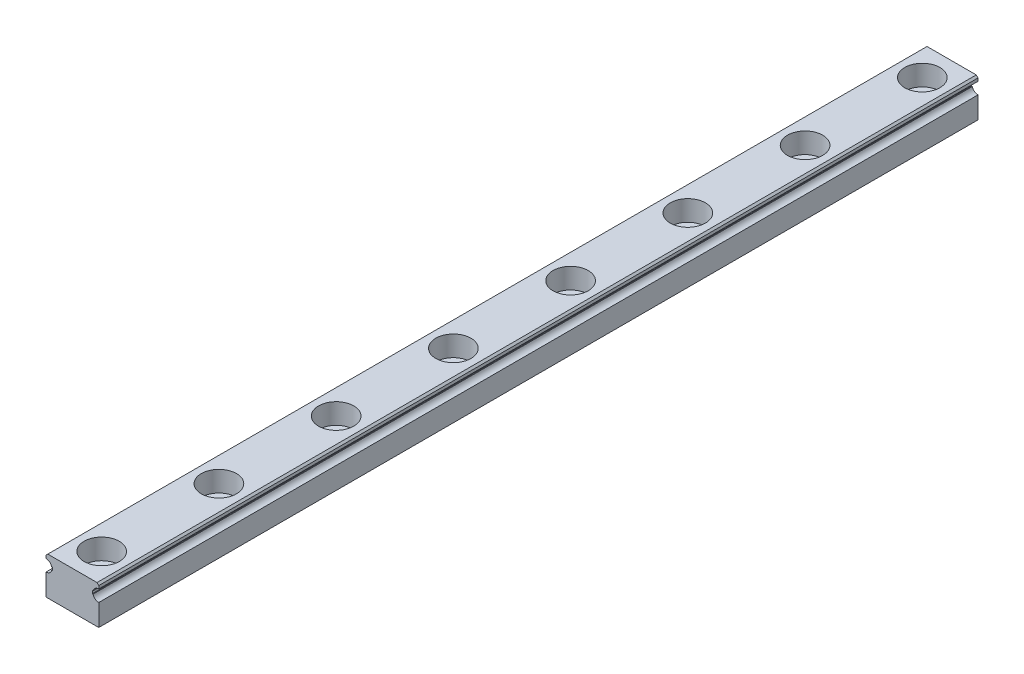
ISO-10303-21;
HEADER;
FILE_DESCRIPTION(('STEP AP214'),'2;1');
FILE_NAME('part.step','',(''),(''),'','','');
FILE_SCHEMA(('AUTOMOTIVE_DESIGN { 1 0 10303 214 1 1 1 1 }'));
ENDSEC;
DATA;
#1=APPLICATION_CONTEXT('core data for automotive mechanical design processes');
#2=APPLICATION_PROTOCOL_DEFINITION('international standard','automotive_design',2000,#1);
#3=PRODUCT_CONTEXT('',#1,'mechanical');
#4=PRODUCT('Part','Part','',(#3));
#5=PRODUCT_RELATED_PRODUCT_CATEGORY('part','',(#4));
#6=PRODUCT_DEFINITION_FORMATION('','',#4);
#7=PRODUCT_DEFINITION_CONTEXT('part definition',#1,'design');
#8=PRODUCT_DEFINITION('design','',#6,#7);
#9=PRODUCT_DEFINITION_SHAPE('','',#8);
#10=(LENGTH_UNIT() NAMED_UNIT(*) SI_UNIT(.MILLI.,.METRE.));
#11=(NAMED_UNIT(*) PLANE_ANGLE_UNIT() SI_UNIT($,.RADIAN.));
#12=(NAMED_UNIT(*) SI_UNIT($,.STERADIAN.) SOLID_ANGLE_UNIT());
#13=UNCERTAINTY_MEASURE_WITH_UNIT(LENGTH_MEASURE(1.E-05),#10,'distance_accuracy_value','');
#14=(GEOMETRIC_REPRESENTATION_CONTEXT(3) GLOBAL_UNCERTAINTY_ASSIGNED_CONTEXT((#13)) GLOBAL_UNIT_ASSIGNED_CONTEXT((#10,
#11,#12)) REPRESENTATION_CONTEXT('',''));
#15=CARTESIAN_POINT('',(0.,0.,0.));
#16=DIRECTION('',(0.,0.,1.));
#17=DIRECTION('',(1.,0.,0.));
#18=AXIS2_PLACEMENT_3D('',#15,#16,#17);
#19=CARTESIAN_POINT('',(0.,-3.25,145.));
#20=DIRECTION('',(0.,1.,0.));
#21=DIRECTION('',(0.,0.,1.));
#22=AXIS2_PLACEMENT_3D('',#19,#20,#21);
#23=CYLINDRICAL_SURFACE('',#22,1.75);
#24=CARTESIAN_POINT('',(0.,-0.25,145.));
#25=DIRECTION('',(0.,1.,0.));
#26=DIRECTION('',(0.,0.,1.));
#27=AXIS2_PLACEMENT_3D('',#24,#25,#26);
#28=CIRCLE('',#27,1.75);
#29=CARTESIAN_POINT('',(0.,-0.25,146.75));
#30=VERTEX_POINT('',#29);
#31=EDGE_CURVE('E11',#30,#30,#28,.T.);
#32=ORIENTED_EDGE('',*,*,#31,.T.);
#33=EDGE_LOOP('',(#32));
#34=FACE_BOUND('',#33,.T.);
#35=CARTESIAN_POINT('',(0.,-3.25,145.));
#36=DIRECTION('',(0.,1.,0.));
#37=DIRECTION('',(0.,0.,1.));
#38=AXIS2_PLACEMENT_3D('',#35,#36,#37);
#39=CIRCLE('',#38,1.75);
#40=CARTESIAN_POINT('',(0.,-3.25,146.75));
#41=VERTEX_POINT('',#40);
#42=EDGE_CURVE('E197',#41,#41,#39,.T.);
#43=ORIENTED_EDGE('',*,*,#42,.F.);
#44=EDGE_LOOP('',(#43));
#45=FACE_BOUND('',#44,.T.);
#46=ADVANCED_FACE('F17',(#34,#45),#23,.F.);
#47=CARTESIAN_POINT('',(0.,-3.25,125.));
#48=DIRECTION('',(0.,1.,0.));
#49=DIRECTION('',(0.,0.,1.));
#50=AXIS2_PLACEMENT_3D('',#47,#48,#49);
#51=CYLINDRICAL_SURFACE('',#50,1.75);
#52=CARTESIAN_POINT('',(0.,-0.25,125.));
#53=DIRECTION('',(0.,1.,0.));
#54=DIRECTION('',(0.,0.,1.));
#55=AXIS2_PLACEMENT_3D('',#52,#53,#54);
#56=CIRCLE('',#55,1.75);
#57=CARTESIAN_POINT('',(0.,-0.25,126.75));
#58=VERTEX_POINT('',#57);
#59=EDGE_CURVE('E289',#58,#58,#56,.T.);
#60=ORIENTED_EDGE('',*,*,#59,.T.);
#61=EDGE_LOOP('',(#60));
#62=FACE_BOUND('',#61,.T.);
#63=CARTESIAN_POINT('',(0.,-3.25,125.));
#64=DIRECTION('',(0.,1.,0.));
#65=DIRECTION('',(0.,0.,1.));
#66=AXIS2_PLACEMENT_3D('',#63,#64,#65);
#67=CIRCLE('',#66,1.75);
#68=CARTESIAN_POINT('',(0.,-3.25,126.75));
#69=VERTEX_POINT('',#68);
#70=EDGE_CURVE('E274',#69,#69,#67,.T.);
#71=ORIENTED_EDGE('',*,*,#70,.F.);
#72=EDGE_LOOP('',(#71));
#73=FACE_BOUND('',#72,.T.);
#74=ADVANCED_FACE('F862',(#62,#73),#51,.F.);
#75=CARTESIAN_POINT('',(0.,-3.25,105.));
#76=DIRECTION('',(0.,1.,0.));
#77=DIRECTION('',(0.,0.,1.));
#78=AXIS2_PLACEMENT_3D('',#75,#76,#77);
#79=CYLINDRICAL_SURFACE('',#78,1.75);
#80=CARTESIAN_POINT('',(0.,-0.25,105.));
#81=DIRECTION('',(0.,1.,0.));
#82=DIRECTION('',(0.,0.,1.));
#83=AXIS2_PLACEMENT_3D('',#80,#81,#82);
#84=CIRCLE('',#83,1.75);
#85=CARTESIAN_POINT('',(0.,-0.25,106.75));
#86=VERTEX_POINT('',#85);
#87=EDGE_CURVE('E290',#86,#86,#84,.T.);
#88=ORIENTED_EDGE('',*,*,#87,.T.);
#89=EDGE_LOOP('',(#88));
#90=FACE_BOUND('',#89,.T.);
#91=CARTESIAN_POINT('',(0.,-3.25,105.));
#92=DIRECTION('',(0.,1.,0.));
#93=DIRECTION('',(0.,0.,1.));
#94=AXIS2_PLACEMENT_3D('',#91,#92,#93);
#95=CIRCLE('',#94,1.75);
#96=CARTESIAN_POINT('',(0.,-3.25,106.75));
#97=VERTEX_POINT('',#96);
#98=EDGE_CURVE('E261',#97,#97,#95,.T.);
#99=ORIENTED_EDGE('',*,*,#98,.F.);
#100=EDGE_LOOP('',(#99));
#101=FACE_BOUND('',#100,.T.);
#102=ADVANCED_FACE('F856',(#90,#101),#79,.F.);
#103=CARTESIAN_POINT('',(0.,-3.25,85.));
#104=DIRECTION('',(0.,1.,0.));
#105=DIRECTION('',(0.,0.,1.));
#106=AXIS2_PLACEMENT_3D('',#103,#104,#105);
#107=CYLINDRICAL_SURFACE('',#106,1.75);
#108=CARTESIAN_POINT('',(0.,-0.25,85.));
#109=DIRECTION('',(0.,1.,0.));
#110=DIRECTION('',(0.,0.,1.));
#111=AXIS2_PLACEMENT_3D('',#108,#109,#110);
#112=CIRCLE('',#111,1.75);
#113=CARTESIAN_POINT('',(0.,-0.25,86.75));
#114=VERTEX_POINT('',#113);
#115=EDGE_CURVE('E345',#114,#114,#112,.T.);
#116=ORIENTED_EDGE('',*,*,#115,.T.);
#117=EDGE_LOOP('',(#116));
#118=FACE_BOUND('',#117,.T.);
#119=CARTESIAN_POINT('',(0.,-3.25,85.));
#120=DIRECTION('',(0.,1.,0.));
#121=DIRECTION('',(0.,0.,1.));
#122=AXIS2_PLACEMENT_3D('',#119,#120,#121);
#123=CIRCLE('',#122,1.75);
#124=CARTESIAN_POINT('',(0.,-3.25,86.75));
#125=VERTEX_POINT('',#124);
#126=EDGE_CURVE('E256',#125,#125,#123,.T.);
#127=ORIENTED_EDGE('',*,*,#126,.F.);
#128=EDGE_LOOP('',(#127));
#129=FACE_BOUND('',#128,.T.);
#130=ADVANCED_FACE('F861',(#118,#129),#107,.F.);
#131=CARTESIAN_POINT('',(0.,-3.25,65.));
#132=DIRECTION('',(0.,1.,0.));
#133=DIRECTION('',(0.,0.,1.));
#134=AXIS2_PLACEMENT_3D('',#131,#132,#133);
#135=CYLINDRICAL_SURFACE('',#134,1.75);
#136=CARTESIAN_POINT('',(0.,-0.25,65.));
#137=DIRECTION('',(0.,1.,0.));
#138=DIRECTION('',(0.,0.,1.));
#139=AXIS2_PLACEMENT_3D('',#136,#137,#138);
#140=CIRCLE('',#139,1.75);
#141=CARTESIAN_POINT('',(0.,-0.25,66.75));
#142=VERTEX_POINT('',#141);
#143=EDGE_CURVE('E346',#142,#142,#140,.T.);
#144=ORIENTED_EDGE('',*,*,#143,.T.);
#145=EDGE_LOOP('',(#144));
#146=FACE_BOUND('',#145,.T.);
#147=CARTESIAN_POINT('',(0.,-3.25,65.));
#148=DIRECTION('',(0.,1.,0.));
#149=DIRECTION('',(0.,0.,1.));
#150=AXIS2_PLACEMENT_3D('',#147,#148,#149);
#151=CIRCLE('',#150,1.75);
#152=CARTESIAN_POINT('',(0.,-3.25,66.75));
#153=VERTEX_POINT('',#152);
#154=EDGE_CURVE('E260',#153,#153,#151,.T.);
#155=ORIENTED_EDGE('',*,*,#154,.F.);
#156=EDGE_LOOP('',(#155));
#157=FACE_BOUND('',#156,.T.);
#158=ADVANCED_FACE('F1074',(#146,#157),#135,.F.);
#159=CARTESIAN_POINT('',(0.,-3.25,45.));
#160=DIRECTION('',(0.,1.,0.));
#161=DIRECTION('',(0.,0.,1.));
#162=AXIS2_PLACEMENT_3D('',#159,#160,#161);
#163=CYLINDRICAL_SURFACE('',#162,1.75);
#164=CARTESIAN_POINT('',(0.,-0.25,45.));
#165=DIRECTION('',(0.,1.,0.));
#166=DIRECTION('',(0.,0.,1.));
#167=AXIS2_PLACEMENT_3D('',#164,#165,#166);
#168=CIRCLE('',#167,1.75);
#169=CARTESIAN_POINT('',(0.,-0.25,46.75));
#170=VERTEX_POINT('',#169);
#171=EDGE_CURVE('E279',#170,#170,#168,.T.);
#172=ORIENTED_EDGE('',*,*,#171,.T.);
#173=EDGE_LOOP('',(#172));
#174=FACE_BOUND('',#173,.T.);
#175=CARTESIAN_POINT('',(0.,-3.25,45.));
#176=DIRECTION('',(0.,1.,0.));
#177=DIRECTION('',(0.,0.,1.));
#178=AXIS2_PLACEMENT_3D('',#175,#176,#177);
#179=CIRCLE('',#178,1.75);
#180=CARTESIAN_POINT('',(0.,-3.25,46.75));
#181=VERTEX_POINT('',#180);
#182=EDGE_CURVE('E284',#181,#181,#179,.T.);
#183=ORIENTED_EDGE('',*,*,#182,.F.);
#184=EDGE_LOOP('',(#183));
#185=FACE_BOUND('',#184,.T.);
#186=ADVANCED_FACE('F1065',(#174,#185),#163,.F.);
#187=CARTESIAN_POINT('',(0.,-3.25,25.));
#188=DIRECTION('',(0.,1.,0.));
#189=DIRECTION('',(0.,0.,1.));
#190=AXIS2_PLACEMENT_3D('',#187,#188,#189);
#191=CYLINDRICAL_SURFACE('',#190,1.75);
#192=CARTESIAN_POINT('',(0.,-0.25,25.));
#193=DIRECTION('',(0.,1.,0.));
#194=DIRECTION('',(0.,0.,1.));
#195=AXIS2_PLACEMENT_3D('',#192,#193,#194);
#196=CIRCLE('',#195,1.75);
#197=CARTESIAN_POINT('',(0.,-0.25,26.75));
#198=VERTEX_POINT('',#197);
#199=EDGE_CURVE('E280',#198,#198,#196,.T.);
#200=ORIENTED_EDGE('',*,*,#199,.T.);
#201=EDGE_LOOP('',(#200));
#202=FACE_BOUND('',#201,.T.);
#203=CARTESIAN_POINT('',(0.,-3.25,25.));
#204=DIRECTION('',(0.,1.,0.));
#205=DIRECTION('',(0.,0.,1.));
#206=AXIS2_PLACEMENT_3D('',#203,#204,#205);
#207=CIRCLE('',#206,1.75);
#208=CARTESIAN_POINT('',(0.,-3.25,26.75));
#209=VERTEX_POINT('',#208);
#210=EDGE_CURVE('E294',#209,#209,#207,.T.);
#211=ORIENTED_EDGE('',*,*,#210,.F.);
#212=EDGE_LOOP('',(#211));
#213=FACE_BOUND('',#212,.T.);
#214=ADVANCED_FACE('F843',(#202,#213),#191,.F.);
#215=CARTESIAN_POINT('',(0.,-0.25,145.));
#216=DIRECTION('',(0.,1.,0.));
#217=DIRECTION('',(0.,0.,1.));
#218=AXIS2_PLACEMENT_3D('',#215,#216,#217);
#219=CYLINDRICAL_SURFACE('',#218,3.);
#220=CARTESIAN_POINT('',(0.,3.25,145.));
#221=DIRECTION('',(0.,1.,0.));
#222=DIRECTION('',(0.,0.,1.));
#223=AXIS2_PLACEMENT_3D('',#220,#221,#222);
#224=CIRCLE('',#223,3.);
#225=CARTESIAN_POINT('',(0.,3.25,148.));
#226=VERTEX_POINT('',#225);
#227=EDGE_CURVE('E228',#226,#226,#224,.T.);
#228=ORIENTED_EDGE('',*,*,#227,.T.);
#229=EDGE_LOOP('',(#228));
#230=FACE_BOUND('',#229,.T.);
#231=CARTESIAN_POINT('',(0.,-0.25,145.));
#232=DIRECTION('',(0.,1.,0.));
#233=DIRECTION('',(0.,0.,1.));
#234=AXIS2_PLACEMENT_3D('',#231,#232,#233);
#235=CIRCLE('',#234,3.);
#236=CARTESIAN_POINT('',(0.,-0.25,148.));
#237=VERTEX_POINT('',#236);
#238=EDGE_CURVE('E26',#237,#237,#235,.T.);
#239=ORIENTED_EDGE('',*,*,#238,.F.);
#240=EDGE_LOOP('',(#239));
#241=FACE_BOUND('',#240,.T.);
#242=ADVANCED_FACE('F822',(#230,#241),#219,.F.);
#243=CARTESIAN_POINT('',(0.,-0.25,145.));
#244=DIRECTION('',(0.,1.,0.));
#245=DIRECTION('',(1.,0.,0.));
#246=AXIS2_PLACEMENT_3D('',#243,#244,#245);
#247=PLANE('',#246);
#248=ORIENTED_EDGE('',*,*,#31,.F.);
#249=EDGE_LOOP('',(#248));
#250=FACE_BOUND('',#249,.T.);
#251=ORIENTED_EDGE('',*,*,#238,.T.);
#252=EDGE_LOOP('',(#251));
#253=FACE_BOUND('',#252,.T.);
#254=ADVANCED_FACE('F816',(#250,#253),#247,.T.);
#255=CARTESIAN_POINT('',(0.,-0.25,125.));
#256=DIRECTION('',(0.,1.,0.));
#257=DIRECTION('',(0.,0.,1.));
#258=AXIS2_PLACEMENT_3D('',#255,#256,#257);
#259=CYLINDRICAL_SURFACE('',#258,3.);
#260=CARTESIAN_POINT('',(0.,3.25,125.));
#261=DIRECTION('',(0.,1.,0.));
#262=DIRECTION('',(0.,0.,1.));
#263=AXIS2_PLACEMENT_3D('',#260,#261,#262);
#264=CIRCLE('',#263,3.);
#265=CARTESIAN_POINT('',(0.,3.25,128.));
#266=VERTEX_POINT('',#265);
#267=EDGE_CURVE('E232',#266,#266,#264,.T.);
#268=ORIENTED_EDGE('',*,*,#267,.T.);
#269=EDGE_LOOP('',(#268));
#270=FACE_BOUND('',#269,.T.);
#271=CARTESIAN_POINT('',(0.,-0.25,125.));
#272=DIRECTION('',(0.,1.,0.));
#273=DIRECTION('',(0.,0.,1.));
#274=AXIS2_PLACEMENT_3D('',#271,#272,#273);
#275=CIRCLE('',#274,3.);
#276=CARTESIAN_POINT('',(0.,-0.25,128.));
#277=VERTEX_POINT('',#276);
#278=EDGE_CURVE('E285',#277,#277,#275,.T.);
#279=ORIENTED_EDGE('',*,*,#278,.F.);
#280=EDGE_LOOP('',(#279));
#281=FACE_BOUND('',#280,.T.);
#282=ADVANCED_FACE('F821',(#270,#281),#259,.F.);
#283=CARTESIAN_POINT('',(0.,-0.25,125.));
#284=DIRECTION('',(0.,1.,0.));
#285=DIRECTION('',(1.,0.,0.));
#286=AXIS2_PLACEMENT_3D('',#283,#284,#285);
#287=PLANE('',#286);
#288=ORIENTED_EDGE('',*,*,#59,.F.);
#289=EDGE_LOOP('',(#288));
#290=FACE_BOUND('',#289,.T.);
#291=ORIENTED_EDGE('',*,*,#278,.T.);
#292=EDGE_LOOP('',(#291));
#293=FACE_BOUND('',#292,.T.);
#294=ADVANCED_FACE('F1042',(#290,#293),#287,.T.);
#295=CARTESIAN_POINT('',(0.,-0.25,105.));
#296=DIRECTION('',(0.,1.,0.));
#297=DIRECTION('',(0.,0.,1.));
#298=AXIS2_PLACEMENT_3D('',#295,#296,#297);
#299=CYLINDRICAL_SURFACE('',#298,3.);
#300=CARTESIAN_POINT('',(0.,3.25,105.));
#301=DIRECTION('',(0.,1.,0.));
#302=DIRECTION('',(0.,0.,1.));
#303=AXIS2_PLACEMENT_3D('',#300,#301,#302);
#304=CIRCLE('',#303,3.);
#305=CARTESIAN_POINT('',(0.,3.25,108.));
#306=VERTEX_POINT('',#305);
#307=EDGE_CURVE('E236',#306,#306,#304,.T.);
#308=ORIENTED_EDGE('',*,*,#307,.T.);
#309=EDGE_LOOP('',(#308));
#310=FACE_BOUND('',#309,.T.);
#311=CARTESIAN_POINT('',(0.,-0.25,105.));
#312=DIRECTION('',(0.,1.,0.));
#313=DIRECTION('',(0.,0.,1.));
#314=AXIS2_PLACEMENT_3D('',#311,#312,#313);
#315=CIRCLE('',#314,3.);
#316=CARTESIAN_POINT('',(0.,-0.25,108.));
#317=VERTEX_POINT('',#316);
#318=EDGE_CURVE('E351',#317,#317,#315,.T.);
#319=ORIENTED_EDGE('',*,*,#318,.F.);
#320=EDGE_LOOP('',(#319));
#321=FACE_BOUND('',#320,.T.);
#322=ADVANCED_FACE('F895',(#310,#321),#299,.F.);
#323=CARTESIAN_POINT('',(0.,-0.25,105.));
#324=DIRECTION('',(0.,1.,0.));
#325=DIRECTION('',(1.,0.,0.));
#326=AXIS2_PLACEMENT_3D('',#323,#324,#325);
#327=PLANE('',#326);
#328=ORIENTED_EDGE('',*,*,#87,.F.);
#329=EDGE_LOOP('',(#328));
#330=FACE_BOUND('',#329,.T.);
#331=ORIENTED_EDGE('',*,*,#318,.T.);
#332=EDGE_LOOP('',(#331));
#333=FACE_BOUND('',#332,.T.);
#334=ADVANCED_FACE('F889',(#330,#333),#327,.T.);
#335=CARTESIAN_POINT('',(0.,-0.25,85.));
#336=DIRECTION('',(0.,1.,0.));
#337=DIRECTION('',(0.,0.,1.));
#338=AXIS2_PLACEMENT_3D('',#335,#336,#337);
#339=CYLINDRICAL_SURFACE('',#338,3.);
#340=CARTESIAN_POINT('',(0.,3.25,85.));
#341=DIRECTION('',(0.,1.,0.));
#342=DIRECTION('',(0.,0.,1.));
#343=AXIS2_PLACEMENT_3D('',#340,#341,#342);
#344=CIRCLE('',#343,3.);
#345=CARTESIAN_POINT('',(0.,3.25,88.));
#346=VERTEX_POINT('',#345);
#347=EDGE_CURVE('E240',#346,#346,#344,.T.);
#348=ORIENTED_EDGE('',*,*,#347,.T.);
#349=EDGE_LOOP('',(#348));
#350=FACE_BOUND('',#349,.T.);
#351=CARTESIAN_POINT('',(0.,-0.25,85.));
#352=DIRECTION('',(0.,1.,0.));
#353=DIRECTION('',(0.,0.,1.));
#354=AXIS2_PLACEMENT_3D('',#351,#352,#353);
#355=CIRCLE('',#354,3.);
#356=CARTESIAN_POINT('',(0.,-0.25,88.));
#357=VERTEX_POINT('',#356);
#358=EDGE_CURVE('E341',#357,#357,#355,.T.);
#359=ORIENTED_EDGE('',*,*,#358,.F.);
#360=EDGE_LOOP('',(#359));
#361=FACE_BOUND('',#360,.T.);
#362=ADVANCED_FACE('F894',(#350,#361),#339,.F.);
#363=CARTESIAN_POINT('',(0.,-0.25,85.));
#364=DIRECTION('',(0.,1.,0.));
#365=DIRECTION('',(1.,0.,0.));
#366=AXIS2_PLACEMENT_3D('',#363,#364,#365);
#367=PLANE('',#366);
#368=ORIENTED_EDGE('',*,*,#115,.F.);
#369=EDGE_LOOP('',(#368));
#370=FACE_BOUND('',#369,.T.);
#371=ORIENTED_EDGE('',*,*,#358,.T.);
#372=EDGE_LOOP('',(#371));
#373=FACE_BOUND('',#372,.T.);
#374=ADVANCED_FACE('F1019',(#370,#373),#367,.T.);
#375=CARTESIAN_POINT('',(0.,-0.25,65.));
#376=DIRECTION('',(0.,1.,0.));
#377=DIRECTION('',(0.,0.,1.));
#378=AXIS2_PLACEMENT_3D('',#375,#376,#377);
#379=CYLINDRICAL_SURFACE('',#378,3.);
#380=CARTESIAN_POINT('',(0.,3.25,65.));
#381=DIRECTION('',(0.,1.,0.));
#382=DIRECTION('',(0.,0.,1.));
#383=AXIS2_PLACEMENT_3D('',#380,#381,#382);
#384=CIRCLE('',#383,3.);
#385=CARTESIAN_POINT('',(0.,3.25,68.));
#386=VERTEX_POINT('',#385);
#387=EDGE_CURVE('E244',#386,#386,#384,.T.);
#388=ORIENTED_EDGE('',*,*,#387,.T.);
#389=EDGE_LOOP('',(#388));
#390=FACE_BOUND('',#389,.T.);
#391=CARTESIAN_POINT('',(0.,-0.25,65.));
#392=DIRECTION('',(0.,1.,0.));
#393=DIRECTION('',(0.,0.,1.));
#394=AXIS2_PLACEMENT_3D('',#391,#392,#393);
#395=CIRCLE('',#394,3.);
#396=CARTESIAN_POINT('',(0.,-0.25,68.));
#397=VERTEX_POINT('',#396);
#398=EDGE_CURVE('E389',#397,#397,#395,.T.);
#399=ORIENTED_EDGE('',*,*,#398,.F.);
#400=EDGE_LOOP('',(#399));
#401=FACE_BOUND('',#400,.T.);
#402=ADVANCED_FACE('F1010',(#390,#401),#379,.F.);
#403=CARTESIAN_POINT('',(0.,-0.25,65.));
#404=DIRECTION('',(0.,1.,0.));
#405=DIRECTION('',(1.,0.,0.));
#406=AXIS2_PLACEMENT_3D('',#403,#404,#405);
#407=PLANE('',#406);
#408=ORIENTED_EDGE('',*,*,#143,.F.);
#409=EDGE_LOOP('',(#408));
#410=FACE_BOUND('',#409,.T.);
#411=ORIENTED_EDGE('',*,*,#398,.T.);
#412=EDGE_LOOP('',(#411));
#413=FACE_BOUND('',#412,.T.);
#414=ADVANCED_FACE('F1001',(#410,#413),#407,.T.);
#415=CARTESIAN_POINT('',(0.,-0.25,45.));
#416=DIRECTION('',(0.,1.,0.));
#417=DIRECTION('',(0.,0.,1.));
#418=AXIS2_PLACEMENT_3D('',#415,#416,#417);
#419=CYLINDRICAL_SURFACE('',#418,3.);
#420=CARTESIAN_POINT('',(0.,3.25,45.));
#421=DIRECTION('',(0.,1.,0.));
#422=DIRECTION('',(0.,0.,1.));
#423=AXIS2_PLACEMENT_3D('',#420,#421,#422);
#424=CIRCLE('',#423,3.);
#425=CARTESIAN_POINT('',(0.,3.25,48.));
#426=VERTEX_POINT('',#425);
#427=EDGE_CURVE('E248',#426,#426,#424,.T.);
#428=ORIENTED_EDGE('',*,*,#427,.T.);
#429=EDGE_LOOP('',(#428));
#430=FACE_BOUND('',#429,.T.);
#431=CARTESIAN_POINT('',(0.,-0.25,45.));
#432=DIRECTION('',(0.,1.,0.));
#433=DIRECTION('',(0.,0.,1.));
#434=AXIS2_PLACEMENT_3D('',#431,#432,#433);
#435=CIRCLE('',#434,3.);
#436=CARTESIAN_POINT('',(0.,-0.25,48.));
#437=VERTEX_POINT('',#436);
#438=EDGE_CURVE('E275',#437,#437,#435,.T.);
#439=ORIENTED_EDGE('',*,*,#438,.F.);
#440=EDGE_LOOP('',(#439));
#441=FACE_BOUND('',#440,.T.);
#442=ADVANCED_FACE('F992',(#430,#441),#419,.F.);
#443=CARTESIAN_POINT('',(0.,-0.25,45.));
#444=DIRECTION('',(0.,1.,0.));
#445=DIRECTION('',(1.,0.,0.));
#446=AXIS2_PLACEMENT_3D('',#443,#444,#445);
#447=PLANE('',#446);
#448=ORIENTED_EDGE('',*,*,#171,.F.);
#449=EDGE_LOOP('',(#448));
#450=FACE_BOUND('',#449,.T.);
#451=ORIENTED_EDGE('',*,*,#438,.T.);
#452=EDGE_LOOP('',(#451));
#453=FACE_BOUND('',#452,.T.);
#454=ADVANCED_FACE('F776',(#450,#453),#447,.T.);
#455=CARTESIAN_POINT('',(0.,-0.25,25.));
#456=DIRECTION('',(0.,1.,0.));
#457=DIRECTION('',(1.,0.,0.));
#458=AXIS2_PLACEMENT_3D('',#455,#456,#457);
#459=PLANE('',#458);
#460=ORIENTED_EDGE('',*,*,#199,.F.);
#461=EDGE_LOOP('',(#460));
#462=FACE_BOUND('',#461,.T.);
#463=CARTESIAN_POINT('',(0.,-0.25,25.));
#464=DIRECTION('',(0.,1.,0.));
#465=DIRECTION('',(0.,0.,1.));
#466=AXIS2_PLACEMENT_3D('',#463,#464,#465);
#467=CIRCLE('',#466,3.);
#468=CARTESIAN_POINT('',(0.,-0.25,28.));
#469=VERTEX_POINT('',#468);
#470=EDGE_CURVE('E306',#469,#469,#467,.T.);
#471=ORIENTED_EDGE('',*,*,#470,.T.);
#472=EDGE_LOOP('',(#471));
#473=FACE_BOUND('',#472,.T.);
#474=ADVANCED_FACE('F770',(#462,#473),#459,.T.);
#475=CARTESIAN_POINT('',(0.,-0.25,25.));
#476=DIRECTION('',(0.,1.,0.));
#477=DIRECTION('',(0.,0.,1.));
#478=AXIS2_PLACEMENT_3D('',#475,#476,#477);
#479=CYLINDRICAL_SURFACE('',#478,3.);
#480=CARTESIAN_POINT('',(0.,3.25,25.));
#481=DIRECTION('',(0.,1.,0.));
#482=DIRECTION('',(0.,0.,1.));
#483=AXIS2_PLACEMENT_3D('',#480,#481,#482);
#484=CIRCLE('',#483,3.);
#485=CARTESIAN_POINT('',(0.,3.25,28.));
#486=VERTEX_POINT('',#485);
#487=EDGE_CURVE('E224',#486,#486,#484,.T.);
#488=ORIENTED_EDGE('',*,*,#487,.T.);
#489=EDGE_LOOP('',(#488));
#490=FACE_BOUND('',#489,.T.);
#491=ORIENTED_EDGE('',*,*,#470,.F.);
#492=EDGE_LOOP('',(#491));
#493=FACE_BOUND('',#492,.T.);
#494=ADVANCED_FACE('F775',(#490,#493),#479,.F.);
#495=CARTESIAN_POINT('',(0.,-3.25,5.));
#496=DIRECTION('',(0.,1.,0.));
#497=DIRECTION('',(0.,0.,1.));
#498=AXIS2_PLACEMENT_3D('',#495,#496,#497);
#499=CYLINDRICAL_SURFACE('',#498,1.75);
#500=CARTESIAN_POINT('',(0.,-0.25,5.));
#501=DIRECTION('',(0.,1.,0.));
#502=DIRECTION('',(0.,0.,1.));
#503=AXIS2_PLACEMENT_3D('',#500,#501,#502);
#504=CIRCLE('',#503,1.75);
#505=CARTESIAN_POINT('',(0.,-0.25,6.75));
#506=VERTEX_POINT('',#505);
#507=EDGE_CURVE('E340',#506,#506,#504,.T.);
#508=ORIENTED_EDGE('',*,*,#507,.T.);
#509=EDGE_LOOP('',(#508));
#510=FACE_BOUND('',#509,.T.);
#511=CARTESIAN_POINT('',(0.,-3.25,5.));
#512=DIRECTION('',(0.,1.,0.));
#513=DIRECTION('',(0.,0.,1.));
#514=AXIS2_PLACEMENT_3D('',#511,#512,#513);
#515=CIRCLE('',#514,1.75);
#516=CARTESIAN_POINT('',(0.,-3.25,6.75));
#517=VERTEX_POINT('',#516);
#518=EDGE_CURVE('E186',#517,#517,#515,.T.);
#519=ORIENTED_EDGE('',*,*,#518,.F.);
#520=EDGE_LOOP('',(#519));
#521=FACE_BOUND('',#520,.T.);
#522=ADVANCED_FACE('F969',(#510,#521),#499,.F.);
#523=CARTESIAN_POINT('',(0.,-0.25,5.));
#524=DIRECTION('',(0.,1.,0.));
#525=DIRECTION('',(1.,0.,0.));
#526=AXIS2_PLACEMENT_3D('',#523,#524,#525);
#527=PLANE('',#526);
#528=ORIENTED_EDGE('',*,*,#507,.F.);
#529=EDGE_LOOP('',(#528));
#530=FACE_BOUND('',#529,.T.);
#531=CARTESIAN_POINT('',(0.,-0.25,5.));
#532=DIRECTION('',(0.,1.,0.));
#533=DIRECTION('',(0.,0.,1.));
#534=AXIS2_PLACEMENT_3D('',#531,#532,#533);
#535=CIRCLE('',#534,3.);
#536=CARTESIAN_POINT('',(0.,-0.25,8.));
#537=VERTEX_POINT('',#536);
#538=EDGE_CURVE('E336',#537,#537,#535,.T.);
#539=ORIENTED_EDGE('',*,*,#538,.T.);
#540=EDGE_LOOP('',(#539));
#541=FACE_BOUND('',#540,.T.);
#542=ADVANCED_FACE('F960',(#530,#541),#527,.T.);
#543=CARTESIAN_POINT('',(0.,-0.25,5.));
#544=DIRECTION('',(0.,1.,0.));
#545=DIRECTION('',(0.,0.,1.));
#546=AXIS2_PLACEMENT_3D('',#543,#544,#545);
#547=CYLINDRICAL_SURFACE('',#546,3.);
#548=CARTESIAN_POINT('',(0.,3.25,5.));
#549=DIRECTION('',(0.,1.,0.));
#550=DIRECTION('',(0.,0.,1.));
#551=AXIS2_PLACEMENT_3D('',#548,#549,#550);
#552=CIRCLE('',#551,3.);
#553=CARTESIAN_POINT('',(0.,3.25,8.));
#554=VERTEX_POINT('',#553);
#555=EDGE_CURVE('E220',#554,#554,#552,.T.);
#556=ORIENTED_EDGE('',*,*,#555,.T.);
#557=EDGE_LOOP('',(#556));
#558=FACE_BOUND('',#557,.T.);
#559=ORIENTED_EDGE('',*,*,#538,.F.);
#560=EDGE_LOOP('',(#559));
#561=FACE_BOUND('',#560,.T.);
#562=ADVANCED_FACE('F952',(#558,#561),#547,.F.);
#563=CARTESIAN_POINT('',(-4.5,1.45,0.));
#564=DIRECTION('',(0.,0.,1.));
#565=DIRECTION('',(1.,0.,0.));
#566=AXIS2_PLACEMENT_3D('',#563,#564,#565);
#567=PLANE('',#566);
#568=DIRECTION('',(-1.,0.,0.));
#569=VECTOR('',#568,1.);
#570=CARTESIAN_POINT('',(4.20000000000009,3.25,0.));
#571=LINE('',#570,#569);
#572=CARTESIAN_POINT('',(4.20000000000009,3.25,0.));
#573=VERTEX_POINT('',#572);
#574=CARTESIAN_POINT('',(-4.2,3.25,0.));
#575=VERTEX_POINT('',#574);
#576=EDGE_CURVE('E212',#573,#575,#571,.T.);
#577=ORIENTED_EDGE('',*,*,#576,.F.);
#578=DIRECTION('',(0.707106781186483,-0.707106781186612,0.));
#579=VECTOR('',#578,1.);
#580=CARTESIAN_POINT('',(4.5,2.95,0.));
#581=LINE('',#580,#579);
#582=CARTESIAN_POINT('',(4.5,2.95,0.));
#583=VERTEX_POINT('',#582);
#584=EDGE_CURVE('E255',#573,#583,#581,.T.);
#585=ORIENTED_EDGE('',*,*,#584,.T.);
#586=DIRECTION('',(0.,1.,0.));
#587=VECTOR('',#586,1.);
#588=CARTESIAN_POINT('',(4.5,2.45,0.));
#589=LINE('',#588,#587);
#590=CARTESIAN_POINT('',(4.5,2.45,0.));
#591=VERTEX_POINT('',#590);
#592=EDGE_CURVE('E219',#591,#583,#589,.T.);
#593=ORIENTED_EDGE('',*,*,#592,.F.);
#594=CARTESIAN_POINT('',(4.5,1.45,0.));
#595=DIRECTION('',(0.,0.,-1.));
#596=DIRECTION('',(-1.,0.,0.));
#597=AXIS2_PLACEMENT_3D('',#594,#595,#596);
#598=CIRCLE('',#597,1.);
#599=CARTESIAN_POINT('',(3.53175416344815,1.7,0.));
#600=VERTEX_POINT('',#599);
#601=EDGE_CURVE('E39',#600,#591,#598,.T.);
#602=ORIENTED_EDGE('',*,*,#601,.F.);
#603=DIRECTION('',(1.,0.,0.));
#604=VECTOR('',#603,1.);
#605=CARTESIAN_POINT('',(3.4,1.7,0.));
#606=LINE('',#605,#604);
#607=CARTESIAN_POINT('',(3.4,1.7,0.));
#608=VERTEX_POINT('',#607);
#609=EDGE_CURVE('E311',#608,#600,#606,.T.);
#610=ORIENTED_EDGE('',*,*,#609,.F.);
#611=DIRECTION('',(0.,1.,0.));
#612=VECTOR('',#611,1.);
#613=CARTESIAN_POINT('',(3.4,1.2,0.));
#614=LINE('',#613,#612);
#615=CARTESIAN_POINT('',(3.4,1.2,0.));
#616=VERTEX_POINT('',#615);
#617=EDGE_CURVE('E312',#616,#608,#614,.T.);
#618=ORIENTED_EDGE('',*,*,#617,.F.);
#619=DIRECTION('',(-1.,0.,0.));
#620=VECTOR('',#619,1.);
#621=CARTESIAN_POINT('',(3.53175416344815,1.2,0.));
#622=LINE('',#621,#620);
#623=CARTESIAN_POINT('',(3.53175416344815,1.2,0.));
#624=VERTEX_POINT('',#623);
#625=EDGE_CURVE('E316',#624,#616,#622,.T.);
#626=ORIENTED_EDGE('',*,*,#625,.F.);
#627=CARTESIAN_POINT('',(4.5,1.45,0.));
#628=DIRECTION('',(0.,0.,-1.));
#629=DIRECTION('',(-1.,0.,0.));
#630=AXIS2_PLACEMENT_3D('',#627,#628,#629);
#631=CIRCLE('',#630,1.);
#632=CARTESIAN_POINT('',(4.5,0.45,0.));
#633=VERTEX_POINT('',#632);
#634=EDGE_CURVE('E181',#633,#624,#631,.T.);
#635=ORIENTED_EDGE('',*,*,#634,.F.);
#636=DIRECTION('',(0.,1.,0.));
#637=VECTOR('',#636,1.);
#638=CARTESIAN_POINT('',(4.5,-3.25,0.));
#639=LINE('',#638,#637);
#640=CARTESIAN_POINT('',(4.5,-3.25,0.));
#641=VERTEX_POINT('',#640);
#642=EDGE_CURVE('E173',#641,#633,#639,.T.);
#643=ORIENTED_EDGE('',*,*,#642,.F.);
#644=DIRECTION('',(1.,0.,0.));
#645=VECTOR('',#644,1.);
#646=CARTESIAN_POINT('',(-4.5,-3.25,0.));
#647=LINE('',#646,#645);
#648=CARTESIAN_POINT('',(-4.5,-3.25,0.));
#649=VERTEX_POINT('',#648);
#650=EDGE_CURVE('E178',#649,#641,#647,.T.);
#651=ORIENTED_EDGE('',*,*,#650,.F.);
#652=DIRECTION('',(0.,-1.,0.));
#653=VECTOR('',#652,1.);
#654=CARTESIAN_POINT('',(-4.5,0.45,0.));
#655=LINE('',#654,#653);
#656=CARTESIAN_POINT('',(-4.5,0.45,0.));
#657=VERTEX_POINT('',#656);
#658=EDGE_CURVE('E208',#657,#649,#655,.T.);
#659=ORIENTED_EDGE('',*,*,#658,.F.);
#660=CARTESIAN_POINT('',(-4.5,1.45,0.));
#661=DIRECTION('',(0.,0.,-1.));
#662=DIRECTION('',(1.,0.,0.));
#663=AXIS2_PLACEMENT_3D('',#660,#661,#662);
#664=CIRCLE('',#663,1.);
#665=CARTESIAN_POINT('',(-3.53175416344815,1.2,0.));
#666=VERTEX_POINT('',#665);
#667=EDGE_CURVE('E214',#666,#657,#664,.T.);
#668=ORIENTED_EDGE('',*,*,#667,.F.);
#669=DIRECTION('',(-1.,0.,0.));
#670=VECTOR('',#669,1.);
#671=CARTESIAN_POINT('',(-3.4,1.2,0.));
#672=LINE('',#671,#670);
#673=CARTESIAN_POINT('',(-3.4,1.2,0.));
#674=VERTEX_POINT('',#673);
#675=EDGE_CURVE('E451',#674,#666,#672,.T.);
#676=ORIENTED_EDGE('',*,*,#675,.F.);
#677=DIRECTION('',(0.,-1.,0.));
#678=VECTOR('',#677,1.);
#679=CARTESIAN_POINT('',(-3.4,1.7,0.));
#680=LINE('',#679,#678);
#681=CARTESIAN_POINT('',(-3.4,1.7,0.));
#682=VERTEX_POINT('',#681);
#683=EDGE_CURVE('E447',#682,#674,#680,.T.);
#684=ORIENTED_EDGE('',*,*,#683,.F.);
#685=DIRECTION('',(1.,0.,0.));
#686=VECTOR('',#685,1.);
#687=CARTESIAN_POINT('',(-3.53175416344815,1.7,0.));
#688=LINE('',#687,#686);
#689=CARTESIAN_POINT('',(-3.53175416344815,1.7,0.));
#690=VERTEX_POINT('',#689);
#691=EDGE_CURVE('E446',#690,#682,#688,.T.);
#692=ORIENTED_EDGE('',*,*,#691,.F.);
#693=CARTESIAN_POINT('',(-4.5,1.45,0.));
#694=DIRECTION('',(0.,0.,-1.));
#695=DIRECTION('',(1.,0.,0.));
#696=AXIS2_PLACEMENT_3D('',#693,#694,#695);
#697=CIRCLE('',#696,1.);
#698=CARTESIAN_POINT('',(-4.5,2.45,0.));
#699=VERTEX_POINT('',#698);
#700=EDGE_CURVE('E481',#699,#690,#697,.T.);
#701=ORIENTED_EDGE('',*,*,#700,.F.);
#702=DIRECTION('',(0.,-1.,0.));
#703=VECTOR('',#702,1.);
#704=CARTESIAN_POINT('',(-4.5,2.95,0.));
#705=LINE('',#704,#703);
#706=CARTESIAN_POINT('',(-4.5,2.95,0.));
#707=VERTEX_POINT('',#706);
#708=EDGE_CURVE('E461',#707,#699,#705,.T.);
#709=ORIENTED_EDGE('',*,*,#708,.F.);
#710=DIRECTION('',(0.707106781186547,0.707106781186548,0.));
#711=VECTOR('',#710,1.);
#712=CARTESIAN_POINT('',(-4.2,3.25,0.));
#713=LINE('',#712,#711);
#714=EDGE_CURVE('E402',#707,#575,#713,.T.);
#715=ORIENTED_EDGE('',*,*,#714,.T.);
#716=EDGE_LOOP('',(#577,#585,#593,#602,#610,#618,#626,#635,#643,#651,#659,#668,#676,#684,#692,
#701,#709,#715));
#717=FACE_BOUND('',#716,.T.);
#718=ADVANCED_FACE('F176',(#717),#567,.F.);
#719=CARTESIAN_POINT('',(4.5,1.45,390.));
#720=DIRECTION('',(0.,0.,-1.));
#721=DIRECTION('',(-1.,0.,0.));
#722=AXIS2_PLACEMENT_3D('',#719,#720,#721);
#723=CYLINDRICAL_SURFACE('',#722,1.);
#724=CARTESIAN_POINT('',(4.5,1.45,150.));
#725=DIRECTION('',(0.,0.,1.));
#726=DIRECTION('',(-1.,0.,0.));
#727=AXIS2_PLACEMENT_3D('',#724,#725,#726);
#728=CIRCLE('',#727,1.);
#729=CARTESIAN_POINT('',(4.5,2.45,150.));
#730=VERTEX_POINT('',#729);
#731=CARTESIAN_POINT('',(3.53175416344815,1.7,150.));
#732=VERTEX_POINT('',#731);
#733=EDGE_CURVE('E433',#730,#732,#728,.T.);
#734=ORIENTED_EDGE('',*,*,#733,.T.);
#735=DIRECTION('',(0.,0.,-1.));
#736=VECTOR('',#735,1.);
#737=CARTESIAN_POINT('',(3.53175416344815,1.7,390.));
#738=LINE('',#737,#736);
#739=EDGE_CURVE('E333',#732,#600,#738,.T.);
#740=ORIENTED_EDGE('',*,*,#739,.T.);
#741=ORIENTED_EDGE('',*,*,#601,.T.);
#742=DIRECTION('',(0.,0.,-1.));
#743=VECTOR('',#742,1.);
#744=CARTESIAN_POINT('',(4.5,2.45,390.));
#745=LINE('',#744,#743);
#746=EDGE_CURVE('E262',#730,#591,#745,.T.);
#747=ORIENTED_EDGE('',*,*,#746,.F.);
#748=EDGE_LOOP('',(#734,#740,#741,#747));
#749=FACE_BOUND('',#748,.T.);
#750=ADVANCED_FACE('F935',(#749),#723,.F.);
#751=CARTESIAN_POINT('',(3.53175416344815,1.7,390.));
#752=DIRECTION('',(0.,1.,0.));
#753=DIRECTION('',(1.,0.,0.));
#754=AXIS2_PLACEMENT_3D('',#751,#752,#753);
#755=PLANE('',#754);
#756=DIRECTION('',(-1.,0.,0.));
#757=VECTOR('',#756,1.);
#758=CARTESIAN_POINT('',(-0.484122918275927,1.7,150.));
#759=LINE('',#758,#757);
#760=CARTESIAN_POINT('',(3.4,1.7,150.));
#761=VERTEX_POINT('',#760);
#762=EDGE_CURVE('E430',#732,#761,#759,.T.);
#763=ORIENTED_EDGE('',*,*,#762,.T.);
#764=DIRECTION('',(0.,0.,-1.));
#765=VECTOR('',#764,1.);
#766=CARTESIAN_POINT('',(3.4,1.7,390.));
#767=LINE('',#766,#765);
#768=EDGE_CURVE('E307',#761,#608,#767,.T.);
#769=ORIENTED_EDGE('',*,*,#768,.T.);
#770=ORIENTED_EDGE('',*,*,#609,.T.);
#771=ORIENTED_EDGE('',*,*,#739,.F.);
#772=EDGE_LOOP('',(#763,#769,#770,#771));
#773=FACE_BOUND('',#772,.T.);
#774=ADVANCED_FACE('F926',(#773),#755,.F.);
#775=CARTESIAN_POINT('',(3.4,1.2,390.));
#776=DIRECTION('',(-1.,0.,0.));
#777=DIRECTION('',(0.,0.,1.));
#778=AXIS2_PLACEMENT_3D('',#775,#776,#777);
#779=PLANE('',#778);
#780=DIRECTION('',(0.,-1.,0.));
#781=VECTOR('',#780,1.);
#782=CARTESIAN_POINT('',(3.4,1.325,150.));
#783=LINE('',#782,#781);
#784=CARTESIAN_POINT('',(3.4,1.2,150.));
#785=VERTEX_POINT('',#784);
#786=EDGE_CURVE('E426',#761,#785,#783,.T.);
#787=ORIENTED_EDGE('',*,*,#786,.T.);
#788=DIRECTION('',(0.,0.,-1.));
#789=VECTOR('',#788,1.);
#790=CARTESIAN_POINT('',(3.4,1.2,390.));
#791=LINE('',#790,#789);
#792=EDGE_CURVE('E323',#785,#616,#791,.T.);
#793=ORIENTED_EDGE('',*,*,#792,.T.);
#794=ORIENTED_EDGE('',*,*,#617,.T.);
#795=ORIENTED_EDGE('',*,*,#768,.F.);
#796=EDGE_LOOP('',(#787,#793,#794,#795));
#797=FACE_BOUND('',#796,.T.);
#798=ADVANCED_FACE('F874',(#797),#779,.F.);
#799=CARTESIAN_POINT('',(3.53175416344815,1.2,390.));
#800=DIRECTION('',(0.,-1.,0.));
#801=DIRECTION('',(0.,0.,-1.));
#802=AXIS2_PLACEMENT_3D('',#799,#800,#801);
#803=PLANE('',#802);
#804=DIRECTION('',(1.,0.,0.));
#805=VECTOR('',#804,1.);
#806=CARTESIAN_POINT('',(-0.484122918275927,1.2,150.));
#807=LINE('',#806,#805);
#808=CARTESIAN_POINT('',(3.53175416344815,1.2,150.));
#809=VERTEX_POINT('',#808);
#810=EDGE_CURVE('E407',#785,#809,#807,.T.);
#811=ORIENTED_EDGE('',*,*,#810,.T.);
#812=DIRECTION('',(0.,0.,-1.));
#813=VECTOR('',#812,1.);
#814=CARTESIAN_POINT('',(3.53175416344815,1.2,390.));
#815=LINE('',#814,#813);
#816=EDGE_CURVE('E302',#809,#624,#815,.T.);
#817=ORIENTED_EDGE('',*,*,#816,.T.);
#818=ORIENTED_EDGE('',*,*,#625,.T.);
#819=ORIENTED_EDGE('',*,*,#792,.F.);
#820=EDGE_LOOP('',(#811,#817,#818,#819));
#821=FACE_BOUND('',#820,.T.);
#822=ADVANCED_FACE('F869',(#821),#803,.F.);
#823=CARTESIAN_POINT('',(4.5,1.45,390.));
#824=DIRECTION('',(0.,0.,-1.));
#825=DIRECTION('',(-1.,0.,0.));
#826=AXIS2_PLACEMENT_3D('',#823,#824,#825);
#827=CYLINDRICAL_SURFACE('',#826,1.);
#828=CARTESIAN_POINT('',(4.5,1.45,150.));
#829=DIRECTION('',(0.,0.,1.));
#830=DIRECTION('',(-1.,0.,0.));
#831=AXIS2_PLACEMENT_3D('',#828,#829,#830);
#832=CIRCLE('',#831,1.);
#833=CARTESIAN_POINT('',(4.5,0.45,150.));
#834=VERTEX_POINT('',#833);
#835=EDGE_CURVE('E403',#809,#834,#832,.T.);
#836=ORIENTED_EDGE('',*,*,#835,.T.);
#837=DIRECTION('',(0.,0.,-1.));
#838=VECTOR('',#837,1.);
#839=CARTESIAN_POINT('',(4.5,0.45,390.));
#840=LINE('',#839,#838);
#841=EDGE_CURVE('E185',#834,#633,#840,.T.);
#842=ORIENTED_EDGE('',*,*,#841,.T.);
#843=ORIENTED_EDGE('',*,*,#634,.T.);
#844=ORIENTED_EDGE('',*,*,#816,.F.);
#845=EDGE_LOOP('',(#836,#842,#843,#844));
#846=FACE_BOUND('',#845,.T.);
#847=ADVANCED_FACE('F810',(#846),#827,.F.);
#848=CARTESIAN_POINT('',(4.5,-3.25,390.));
#849=DIRECTION('',(-1.,0.,0.));
#850=DIRECTION('',(0.,0.,1.));
#851=AXIS2_PLACEMENT_3D('',#848,#849,#850);
#852=PLANE('',#851);
#853=DIRECTION('',(0.,-1.,0.));
#854=VECTOR('',#853,1.);
#855=CARTESIAN_POINT('',(4.5,-0.9,150.));
#856=LINE('',#855,#854);
#857=CARTESIAN_POINT('',(4.5,-3.25,150.));
#858=VERTEX_POINT('',#857);
#859=EDGE_CURVE('E192',#834,#858,#856,.T.);
#860=ORIENTED_EDGE('',*,*,#859,.T.);
#861=DIRECTION('',(0.,0.,-1.));
#862=VECTOR('',#861,1.);
#863=CARTESIAN_POINT('',(4.5,-3.25,390.));
#864=LINE('',#863,#862);
#865=EDGE_CURVE('E189',#858,#641,#864,.T.);
#866=ORIENTED_EDGE('',*,*,#865,.T.);
#867=ORIENTED_EDGE('',*,*,#642,.T.);
#868=ORIENTED_EDGE('',*,*,#841,.F.);
#869=EDGE_LOOP('',(#860,#866,#867,#868));
#870=FACE_BOUND('',#869,.T.);
#871=ADVANCED_FACE('F190',(#870),#852,.F.);
#872=CARTESIAN_POINT('',(-4.5,-3.25,390.));
#873=DIRECTION('',(0.,1.,0.));
#874=DIRECTION('',(1.,0.,0.));
#875=AXIS2_PLACEMENT_3D('',#872,#873,#874);
#876=PLANE('',#875);
#877=ORIENTED_EDGE('',*,*,#518,.T.);
#878=EDGE_LOOP('',(#877));
#879=FACE_BOUND('',#878,.T.);
#880=ORIENTED_EDGE('',*,*,#210,.T.);
#881=EDGE_LOOP('',(#880));
#882=FACE_BOUND('',#881,.T.);
#883=ORIENTED_EDGE('',*,*,#182,.T.);
#884=EDGE_LOOP('',(#883));
#885=FACE_BOUND('',#884,.T.);
#886=ORIENTED_EDGE('',*,*,#154,.T.);
#887=EDGE_LOOP('',(#886));
#888=FACE_BOUND('',#887,.T.);
#889=ORIENTED_EDGE('',*,*,#126,.T.);
#890=EDGE_LOOP('',(#889));
#891=FACE_BOUND('',#890,.T.);
#892=ORIENTED_EDGE('',*,*,#98,.T.);
#893=EDGE_LOOP('',(#892));
#894=FACE_BOUND('',#893,.T.);
#895=ORIENTED_EDGE('',*,*,#70,.T.);
#896=EDGE_LOOP('',(#895));
#897=FACE_BOUND('',#896,.T.);
#898=ORIENTED_EDGE('',*,*,#42,.T.);
#899=EDGE_LOOP('',(#898));
#900=FACE_BOUND('',#899,.T.);
#901=DIRECTION('',(-1.,0.,0.));
#902=VECTOR('',#901,1.);
#903=CARTESIAN_POINT('',(-4.5,-3.25,150.));
#904=LINE('',#903,#902);
#905=CARTESIAN_POINT('',(-4.5,-3.25,150.));
#906=VERTEX_POINT('',#905);
#907=EDGE_CURVE('E419',#858,#906,#904,.T.);
#908=ORIENTED_EDGE('',*,*,#907,.T.);
#909=DIRECTION('',(0.,0.,-1.));
#910=VECTOR('',#909,1.);
#911=CARTESIAN_POINT('',(-4.5,-3.25,390.));
#912=LINE('',#911,#910);
#913=EDGE_CURVE('E200',#906,#649,#912,.T.);
#914=ORIENTED_EDGE('',*,*,#913,.T.);
#915=ORIENTED_EDGE('',*,*,#650,.T.);
#916=ORIENTED_EDGE('',*,*,#865,.F.);
#917=EDGE_LOOP('',(#908,#914,#915,#916));
#918=FACE_BOUND('',#917,.T.);
#919=ADVANCED_FACE('F199',(#879,#882,#885,#888,#891,#894,#897,#900,#918),#876,.F.);
#920=CARTESIAN_POINT('',(-4.5,-3.25,390.));
#921=DIRECTION('',(1.,0.,0.));
#922=DIRECTION('',(0.,1.,0.));
#923=AXIS2_PLACEMENT_3D('',#920,#921,#922);
#924=PLANE('',#923);
#925=DIRECTION('',(0.,1.,0.));
#926=VECTOR('',#925,1.);
#927=CARTESIAN_POINT('',(-4.5,-0.9,150.));
#928=LINE('',#927,#926);
#929=CARTESIAN_POINT('',(-4.5,0.45,150.));
#930=VERTEX_POINT('',#929);
#931=EDGE_CURVE('E416',#906,#930,#928,.T.);
#932=ORIENTED_EDGE('',*,*,#931,.T.);
#933=DIRECTION('',(0.,0.,-1.));
#934=VECTOR('',#933,1.);
#935=CARTESIAN_POINT('',(-4.5,0.45,390.));
#936=LINE('',#935,#934);
#937=EDGE_CURVE('E218',#930,#657,#936,.T.);
#938=ORIENTED_EDGE('',*,*,#937,.T.);
#939=ORIENTED_EDGE('',*,*,#658,.T.);
#940=ORIENTED_EDGE('',*,*,#913,.F.);
#941=EDGE_LOOP('',(#932,#938,#939,#940));
#942=FACE_BOUND('',#941,.T.);
#943=ADVANCED_FACE('F883',(#942),#924,.F.);
#944=CARTESIAN_POINT('',(-4.5,1.45,390.));
#945=DIRECTION('',(0.,0.,-1.));
#946=DIRECTION('',(-1.,0.,0.));
#947=AXIS2_PLACEMENT_3D('',#944,#945,#946);
#948=CYLINDRICAL_SURFACE('',#947,1.);
#949=CARTESIAN_POINT('',(-4.5,1.45,150.));
#950=DIRECTION('',(0.,0.,1.));
#951=DIRECTION('',(-1.,0.,0.));
#952=AXIS2_PLACEMENT_3D('',#949,#950,#951);
#953=CIRCLE('',#952,1.);
#954=CARTESIAN_POINT('',(-3.53175416344815,1.2,150.));
#955=VERTEX_POINT('',#954);
#956=EDGE_CURVE('E374',#930,#955,#953,.T.);
#957=ORIENTED_EDGE('',*,*,#956,.T.);
#958=DIRECTION('',(0.,0.,-1.));
#959=VECTOR('',#958,1.);
#960=CARTESIAN_POINT('',(-3.53175416344815,1.2,390.));
#961=LINE('',#960,#959);
#962=EDGE_CURVE('E465',#955,#666,#961,.T.);
#963=ORIENTED_EDGE('',*,*,#962,.T.);
#964=ORIENTED_EDGE('',*,*,#667,.T.);
#965=ORIENTED_EDGE('',*,*,#937,.F.);
#966=EDGE_LOOP('',(#957,#963,#964,#965));
#967=FACE_BOUND('',#966,.T.);
#968=ADVANCED_FACE('F834',(#967),#948,.F.);
#969=CARTESIAN_POINT('',(4.5,2.45,390.));
#970=DIRECTION('',(-1.,0.,0.));
#971=DIRECTION('',(0.,1.,0.));
#972=AXIS2_PLACEMENT_3D('',#969,#970,#971);
#973=PLANE('',#972);
#974=DIRECTION('',(0.,-1.,0.));
#975=VECTOR('',#974,1.);
#976=CARTESIAN_POINT('',(4.5,1.95,150.));
#977=LINE('',#976,#975);
#978=CARTESIAN_POINT('',(4.5,2.95,150.));
#979=VERTEX_POINT('',#978);
#980=EDGE_CURVE('E1127',#979,#730,#977,.T.);
#981=ORIENTED_EDGE('',*,*,#980,.T.);
#982=ORIENTED_EDGE('',*,*,#746,.T.);
#983=ORIENTED_EDGE('',*,*,#592,.T.);
#984=DIRECTION('',(0.,0.,1.));
#985=VECTOR('',#984,1.);
#986=CARTESIAN_POINT('',(4.5,2.95,0.));
#987=LINE('',#986,#985);
#988=EDGE_CURVE('E252',#583,#979,#987,.T.);
#989=ORIENTED_EDGE('',*,*,#988,.T.);
#990=EDGE_LOOP('',(#981,#982,#983,#989));
#991=FACE_BOUND('',#990,.T.);
#992=ADVANCED_FACE('F829',(#991),#973,.F.);
#993=CARTESIAN_POINT('',(4.20000000000009,3.25,390.));
#994=DIRECTION('',(-0.707106781186612,-0.707106781186483,0.));
#995=DIRECTION('',(-0.707106781186483,0.707106781186612,0.));
#996=AXIS2_PLACEMENT_3D('',#993,#994,#995);
#997=PLANE('',#996);
#998=DIRECTION('',(0.707106781186483,-0.707106781186612,0.));
#999=VECTOR('',#998,1.);
#1000=CARTESIAN_POINT('',(2.47500000000046,4.97499999999994,150.));
#1001=LINE('',#1000,#999);
#1002=CARTESIAN_POINT('',(4.20000000000009,3.25,150.));
#1003=VERTEX_POINT('',#1002);
#1004=EDGE_CURVE('E1124',#1003,#979,#1001,.T.);
#1005=ORIENTED_EDGE('',*,*,#1004,.T.);
#1006=ORIENTED_EDGE('',*,*,#988,.F.);
#1007=ORIENTED_EDGE('',*,*,#584,.F.);
#1008=DIRECTION('',(0.,0.,-1.));
#1009=VECTOR('',#1008,1.);
#1010=CARTESIAN_POINT('',(4.20000000000009,3.25,390.));
#1011=LINE('',#1010,#1009);
#1012=EDGE_CURVE('E398',#1003,#573,#1011,.T.);
#1013=ORIENTED_EDGE('',*,*,#1012,.F.);
#1014=EDGE_LOOP('',(#1005,#1006,#1007,#1013));
#1015=FACE_BOUND('',#1014,.T.);
#1016=ADVANCED_FACE('F800',(#1015),#997,.F.);
#1017=CARTESIAN_POINT('',(-4.5,3.25,390.));
#1018=DIRECTION('',(0.,-1.,0.));
#1019=DIRECTION('',(0.,0.,-1.));
#1020=AXIS2_PLACEMENT_3D('',#1017,#1018,#1019);
#1021=PLANE('',#1020);
#1022=ORIENTED_EDGE('',*,*,#427,.F.);
#1023=EDGE_LOOP('',(#1022));
#1024=FACE_BOUND('',#1023,.T.);
#1025=ORIENTED_EDGE('',*,*,#387,.F.);
#1026=EDGE_LOOP('',(#1025));
#1027=FACE_BOUND('',#1026,.T.);
#1028=ORIENTED_EDGE('',*,*,#347,.F.);
#1029=EDGE_LOOP('',(#1028));
#1030=FACE_BOUND('',#1029,.T.);
#1031=ORIENTED_EDGE('',*,*,#307,.F.);
#1032=EDGE_LOOP('',(#1031));
#1033=FACE_BOUND('',#1032,.T.);
#1034=ORIENTED_EDGE('',*,*,#267,.F.);
#1035=EDGE_LOOP('',(#1034));
#1036=FACE_BOUND('',#1035,.T.);
#1037=ORIENTED_EDGE('',*,*,#227,.F.);
#1038=EDGE_LOOP('',(#1037));
#1039=FACE_BOUND('',#1038,.T.);
#1040=ORIENTED_EDGE('',*,*,#487,.F.);
#1041=EDGE_LOOP('',(#1040));
#1042=FACE_BOUND('',#1041,.T.);
#1043=ORIENTED_EDGE('',*,*,#555,.F.);
#1044=EDGE_LOOP('',(#1043));
#1045=FACE_BOUND('',#1044,.T.);
#1046=DIRECTION('',(1.,0.,0.));
#1047=VECTOR('',#1046,1.);
#1048=CARTESIAN_POINT('',(-4.5,3.25,150.));
#1049=LINE('',#1048,#1047);
#1050=CARTESIAN_POINT('',(-4.2,3.25,150.));
#1051=VERTEX_POINT('',#1050);
#1052=EDGE_CURVE('E368',#1051,#1003,#1049,.T.);
#1053=ORIENTED_EDGE('',*,*,#1052,.T.);
#1054=ORIENTED_EDGE('',*,*,#1012,.T.);
#1055=ORIENTED_EDGE('',*,*,#576,.T.);
#1056=DIRECTION('',(0.,0.,1.));
#1057=VECTOR('',#1056,1.);
#1058=CARTESIAN_POINT('',(-4.2,3.25,0.));
#1059=LINE('',#1058,#1057);
#1060=EDGE_CURVE('E458',#575,#1051,#1059,.T.);
#1061=ORIENTED_EDGE('',*,*,#1060,.T.);
#1062=EDGE_LOOP('',(#1053,#1054,#1055,#1061));
#1063=FACE_BOUND('',#1062,.T.);
#1064=ADVANCED_FACE('F506',(#1024,#1027,#1030,#1033,#1036,#1039,#1042,#1045,#1063),#1021,.F.);
#1065=CARTESIAN_POINT('',(-4.5,2.95,390.));
#1066=DIRECTION('',(0.707106781186548,-0.707106781186548,0.));
#1067=DIRECTION('',(0.,0.,-1.));
#1068=AXIS2_PLACEMENT_3D('',#1065,#1066,#1067);
#1069=PLANE('',#1068);
#1070=DIRECTION('',(0.707106781186548,0.707106781186548,0.));
#1071=VECTOR('',#1070,1.);
#1072=CARTESIAN_POINT('',(-4.875,2.575,150.));
#1073=LINE('',#1072,#1071);
#1074=CARTESIAN_POINT('',(-4.5,2.95,150.));
#1075=VERTEX_POINT('',#1074);
#1076=EDGE_CURVE('E381',#1075,#1051,#1073,.T.);
#1077=ORIENTED_EDGE('',*,*,#1076,.T.);
#1078=ORIENTED_EDGE('',*,*,#1060,.F.);
#1079=ORIENTED_EDGE('',*,*,#714,.F.);
#1080=DIRECTION('',(0.,0.,-1.));
#1081=VECTOR('',#1080,1.);
#1082=CARTESIAN_POINT('',(-4.5,2.95,390.));
#1083=LINE('',#1082,#1081);
#1084=EDGE_CURVE('E484',#1075,#707,#1083,.T.);
#1085=ORIENTED_EDGE('',*,*,#1084,.F.);
#1086=EDGE_LOOP('',(#1077,#1078,#1079,#1085));
#1087=FACE_BOUND('',#1086,.T.);
#1088=ADVANCED_FACE('F501',(#1087),#1069,.F.);
#1089=CARTESIAN_POINT('',(-4.5,2.45,390.));
#1090=DIRECTION('',(1.,0.,0.));
#1091=DIRECTION('',(0.,1.,0.));
#1092=AXIS2_PLACEMENT_3D('',#1089,#1090,#1091);
#1093=PLANE('',#1092);
#1094=DIRECTION('',(0.,1.,0.));
#1095=VECTOR('',#1094,1.);
#1096=CARTESIAN_POINT('',(-4.5,1.95,150.));
#1097=LINE('',#1096,#1095);
#1098=CARTESIAN_POINT('',(-4.5,2.45,150.));
#1099=VERTEX_POINT('',#1098);
#1100=EDGE_CURVE('E376',#1099,#1075,#1097,.T.);
#1101=ORIENTED_EDGE('',*,*,#1100,.T.);
#1102=ORIENTED_EDGE('',*,*,#1084,.T.);
#1103=ORIENTED_EDGE('',*,*,#708,.T.);
#1104=DIRECTION('',(0.,0.,-1.));
#1105=VECTOR('',#1104,1.);
#1106=CARTESIAN_POINT('',(-4.5,2.45,390.));
#1107=LINE('',#1106,#1105);
#1108=EDGE_CURVE('E477',#1099,#699,#1107,.T.);
#1109=ORIENTED_EDGE('',*,*,#1108,.F.);
#1110=EDGE_LOOP('',(#1101,#1102,#1103,#1109));
#1111=FACE_BOUND('',#1110,.T.);
#1112=ADVANCED_FACE('F757',(#1111),#1093,.F.);
#1113=CARTESIAN_POINT('',(-4.5,1.45,390.));
#1114=DIRECTION('',(0.,0.,-1.));
#1115=DIRECTION('',(-1.,0.,0.));
#1116=AXIS2_PLACEMENT_3D('',#1113,#1114,#1115);
#1117=CYLINDRICAL_SURFACE('',#1116,1.);
#1118=CARTESIAN_POINT('',(-4.5,1.45,150.));
#1119=DIRECTION('',(0.,0.,1.));
#1120=DIRECTION('',(-1.,0.,0.));
#1121=AXIS2_PLACEMENT_3D('',#1118,#1119,#1120);
#1122=CIRCLE('',#1121,1.);
#1123=CARTESIAN_POINT('',(-3.53175416344815,1.7,150.));
#1124=VERTEX_POINT('',#1123);
#1125=EDGE_CURVE('E380',#1124,#1099,#1122,.T.);
#1126=ORIENTED_EDGE('',*,*,#1125,.T.);
#1127=ORIENTED_EDGE('',*,*,#1108,.T.);
#1128=ORIENTED_EDGE('',*,*,#700,.T.);
#1129=DIRECTION('',(0.,0.,-1.));
#1130=VECTOR('',#1129,1.);
#1131=CARTESIAN_POINT('',(-3.53175416344815,1.7,390.));
#1132=LINE('',#1131,#1130);
#1133=EDGE_CURVE('E442',#1124,#690,#1132,.T.);
#1134=ORIENTED_EDGE('',*,*,#1133,.F.);
#1135=EDGE_LOOP('',(#1126,#1127,#1128,#1134));
#1136=FACE_BOUND('',#1135,.T.);
#1137=ADVANCED_FACE('F739',(#1136),#1117,.F.);
#1138=CARTESIAN_POINT('',(-3.53175416344815,1.7,390.));
#1139=DIRECTION('',(0.,1.,0.));
#1140=DIRECTION('',(1.,0.,0.));
#1141=AXIS2_PLACEMENT_3D('',#1138,#1139,#1140);
#1142=PLANE('',#1141);
#1143=DIRECTION('',(-1.,0.,0.));
#1144=VECTOR('',#1143,1.);
#1145=CARTESIAN_POINT('',(-4.01587708172407,1.7,150.));
#1146=LINE('',#1145,#1144);
#1147=CARTESIAN_POINT('',(-3.4,1.7,150.));
#1148=VERTEX_POINT('',#1147);
#1149=EDGE_CURVE('E385',#1148,#1124,#1146,.T.);
#1150=ORIENTED_EDGE('',*,*,#1149,.T.);
#1151=ORIENTED_EDGE('',*,*,#1133,.T.);
#1152=ORIENTED_EDGE('',*,*,#691,.T.);
#1153=DIRECTION('',(0.,0.,-1.));
#1154=VECTOR('',#1153,1.);
#1155=CARTESIAN_POINT('',(-3.4,1.7,390.));
#1156=LINE('',#1155,#1154);
#1157=EDGE_CURVE('E468',#1148,#682,#1156,.T.);
#1158=ORIENTED_EDGE('',*,*,#1157,.F.);
#1159=EDGE_LOOP('',(#1150,#1151,#1152,#1158));
#1160=FACE_BOUND('',#1159,.T.);
#1161=ADVANCED_FACE('F733',(#1160),#1142,.F.);
#1162=CARTESIAN_POINT('',(-3.4,1.2,390.));
#1163=DIRECTION('',(1.,0.,0.));
#1164=DIRECTION('',(0.,1.,0.));
#1165=AXIS2_PLACEMENT_3D('',#1162,#1163,#1164);
#1166=PLANE('',#1165);
#1167=DIRECTION('',(0.,1.,0.));
#1168=VECTOR('',#1167,1.);
#1169=CARTESIAN_POINT('',(-3.4,1.325,150.));
#1170=LINE('',#1169,#1168);
#1171=CARTESIAN_POINT('',(-3.4,1.2,150.));
#1172=VERTEX_POINT('',#1171);
#1173=EDGE_CURVE('E375',#1172,#1148,#1170,.T.);
#1174=ORIENTED_EDGE('',*,*,#1173,.T.);
#1175=ORIENTED_EDGE('',*,*,#1157,.T.);
#1176=ORIENTED_EDGE('',*,*,#683,.T.);
#1177=DIRECTION('',(0.,0.,-1.));
#1178=VECTOR('',#1177,1.);
#1179=CARTESIAN_POINT('',(-3.4,1.2,390.));
#1180=LINE('',#1179,#1178);
#1181=EDGE_CURVE('E438',#1172,#674,#1180,.T.);
#1182=ORIENTED_EDGE('',*,*,#1181,.F.);
#1183=EDGE_LOOP('',(#1174,#1175,#1176,#1182));
#1184=FACE_BOUND('',#1183,.T.);
#1185=ADVANCED_FACE('F738',(#1184),#1166,.F.);
#1186=CARTESIAN_POINT('',(-3.53175416344815,1.2,390.));
#1187=DIRECTION('',(0.,-1.,0.));
#1188=DIRECTION('',(0.,0.,-1.));
#1189=AXIS2_PLACEMENT_3D('',#1186,#1187,#1188);
#1190=PLANE('',#1189);
#1191=DIRECTION('',(1.,0.,0.));
#1192=VECTOR('',#1191,1.);
#1193=CARTESIAN_POINT('',(-4.01587708172407,1.2,150.));
#1194=LINE('',#1193,#1192);
#1195=EDGE_CURVE('E370',#955,#1172,#1194,.T.);
#1196=ORIENTED_EDGE('',*,*,#1195,.T.);
#1197=ORIENTED_EDGE('',*,*,#1181,.T.);
#1198=ORIENTED_EDGE('',*,*,#675,.T.);
#1199=ORIENTED_EDGE('',*,*,#962,.F.);
#1200=EDGE_LOOP('',(#1196,#1197,#1198,#1199));
#1201=FACE_BOUND('',#1200,.T.);
#1202=ADVANCED_FACE('F727',(#1201),#1190,.F.);
#1203=CARTESIAN_POINT('',(-4.5,1.45,150.));
#1204=DIRECTION('',(0.,0.,1.));
#1205=DIRECTION('',(1.,0.,0.));
#1206=AXIS2_PLACEMENT_3D('',#1203,#1204,#1205);
#1207=PLANE('',#1206);
#1208=ORIENTED_EDGE('',*,*,#980,.F.);
#1209=ORIENTED_EDGE('',*,*,#1004,.F.);
#1210=ORIENTED_EDGE('',*,*,#1052,.F.);
#1211=ORIENTED_EDGE('',*,*,#1076,.F.);
#1212=ORIENTED_EDGE('',*,*,#1100,.F.);
#1213=ORIENTED_EDGE('',*,*,#1125,.F.);
#1214=ORIENTED_EDGE('',*,*,#1149,.F.);
#1215=ORIENTED_EDGE('',*,*,#1173,.F.);
#1216=ORIENTED_EDGE('',*,*,#1195,.F.);
#1217=ORIENTED_EDGE('',*,*,#956,.F.);
#1218=ORIENTED_EDGE('',*,*,#931,.F.);
#1219=ORIENTED_EDGE('',*,*,#907,.F.);
#1220=ORIENTED_EDGE('',*,*,#859,.F.);
#1221=ORIENTED_EDGE('',*,*,#835,.F.);
#1222=ORIENTED_EDGE('',*,*,#810,.F.);
#1223=ORIENTED_EDGE('',*,*,#786,.F.);
#1224=ORIENTED_EDGE('',*,*,#762,.F.);
#1225=ORIENTED_EDGE('',*,*,#733,.F.);
#1226=EDGE_LOOP('',(#1208,#1209,#1210,#1211,#1212,#1213,#1214,#1215,#1216,#1217,#1218,#1219,
#1220,#1221,#1222,#1223,#1224,#1225));
#1227=FACE_BOUND('',#1226,.T.);
#1228=ADVANCED_FACE('F723',(#1227),#1207,.T.);
#1229=CLOSED_SHELL('',(#46,#74,#102,#130,#158,#186,#214,#242,#254,#282,#294,#322,#334,#362,#374,
#402,#414,#442,#454,#474,#494,#522,#542,#562,#718,#750,#774,#798,#822,#847,#871,#919,#943,#968,
#992,#1016,#1064,#1088,#1112,#1137,#1161,#1185,#1202,#1228));
#1230=MANIFOLD_SOLID_BREP('B1',#1229);
#1231=ADVANCED_BREP_SHAPE_REPRESENTATION('',(#18,#1230),#14);
#1232=SHAPE_DEFINITION_REPRESENTATION(#9,#1231);
ENDSEC;
END-ISO-10303-21;
